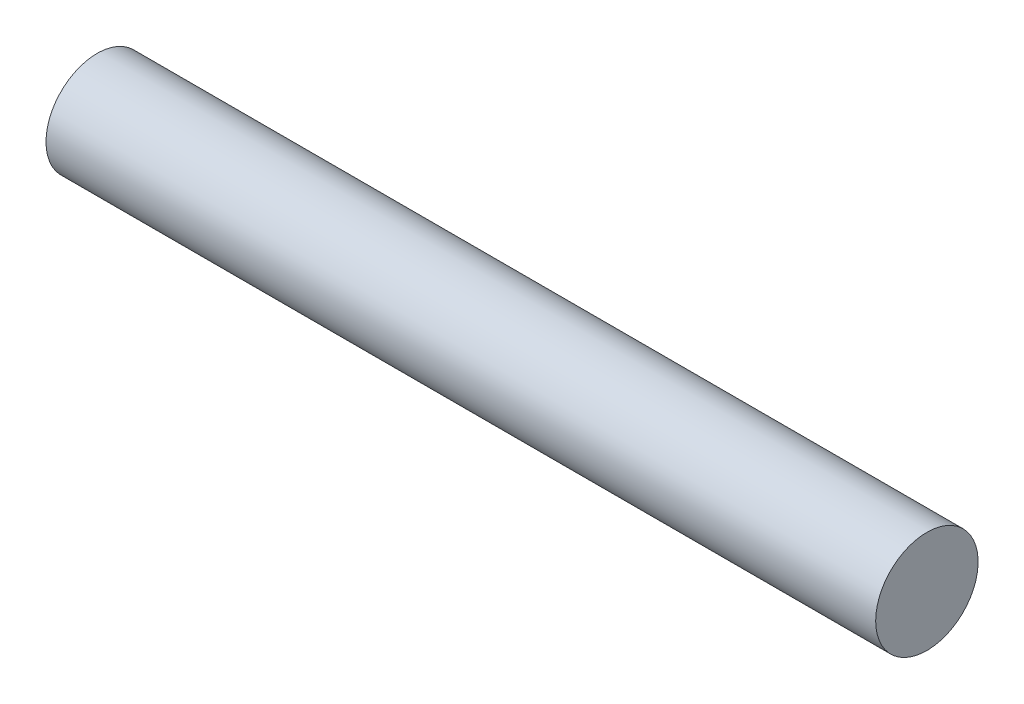
ISO-10303-21;
HEADER;
FILE_DESCRIPTION(('STEP AP214'),'2;1');
FILE_NAME('part.step','',(''),(''),'','','');
FILE_SCHEMA(('AUTOMOTIVE_DESIGN { 1 0 10303 214 1 1 1 1 }'));
ENDSEC;
DATA;
#1=APPLICATION_CONTEXT('core data for automotive mechanical design processes');
#2=APPLICATION_PROTOCOL_DEFINITION('international standard','automotive_design',2000,#1);
#3=PRODUCT_CONTEXT('',#1,'mechanical');
#4=PRODUCT('Part','Part','',(#3));
#5=PRODUCT_RELATED_PRODUCT_CATEGORY('part','',(#4));
#6=PRODUCT_DEFINITION_FORMATION('','',#4);
#7=PRODUCT_DEFINITION_CONTEXT('part definition',#1,'design');
#8=PRODUCT_DEFINITION('design','',#6,#7);
#9=PRODUCT_DEFINITION_SHAPE('','',#8);
#10=(LENGTH_UNIT() NAMED_UNIT(*) SI_UNIT(.MILLI.,.METRE.));
#11=(NAMED_UNIT(*) PLANE_ANGLE_UNIT() SI_UNIT($,.RADIAN.));
#12=(NAMED_UNIT(*) SI_UNIT($,.STERADIAN.) SOLID_ANGLE_UNIT());
#13=UNCERTAINTY_MEASURE_WITH_UNIT(LENGTH_MEASURE(1.E-05),#10,'distance_accuracy_value','');
#14=(GEOMETRIC_REPRESENTATION_CONTEXT(3) GLOBAL_UNCERTAINTY_ASSIGNED_CONTEXT((#13)) GLOBAL_UNIT_ASSIGNED_CONTEXT((#10,
#11,#12)) REPRESENTATION_CONTEXT('',''));
#15=CARTESIAN_POINT('',(0.,0.,0.));
#16=DIRECTION('',(0.,0.,1.));
#17=DIRECTION('',(1.,0.,0.));
#18=AXIS2_PLACEMENT_3D('',#15,#16,#17);
#19=CARTESIAN_POINT('',(0.,0.,0.));
#20=DIRECTION('',(1.,0.,0.));
#21=DIRECTION('',(0.,0.,-1.));
#22=AXIS2_PLACEMENT_3D('',#19,#20,#21);
#23=PLANE('',#22);
#24=CARTESIAN_POINT('',(0.,0.,0.));
#25=DIRECTION('',(-1.,0.,0.));
#26=DIRECTION('',(0.,0.,1.));
#27=AXIS2_PLACEMENT_3D('',#24,#25,#26);
#28=CIRCLE('',#27,1.5);
#29=CARTESIAN_POINT('',(0.,0.,1.5));
#30=VERTEX_POINT('',#29);
#31=EDGE_CURVE('E10',#30,#30,#28,.T.);
#32=ORIENTED_EDGE('',*,*,#31,.T.);
#33=EDGE_LOOP('',(#32));
#34=FACE_BOUND('',#33,.T.);
#35=ADVANCED_FACE('F37',(#34),#23,.F.);
#36=CARTESIAN_POINT('',(0.,0.,0.));
#37=DIRECTION('',(-1.,0.,0.));
#38=DIRECTION('',(0.,0.,1.));
#39=AXIS2_PLACEMENT_3D('',#36,#37,#38);
#40=CYLINDRICAL_SURFACE('',#39,1.5);
#41=ORIENTED_EDGE('',*,*,#31,.F.);
#42=EDGE_LOOP('',(#41));
#43=FACE_BOUND('',#42,.T.);
#44=CARTESIAN_POINT('',(24.3,0.,0.));
#45=DIRECTION('',(-1.,0.,0.));
#46=DIRECTION('',(0.,0.,1.));
#47=AXIS2_PLACEMENT_3D('',#44,#45,#46);
#48=CIRCLE('',#47,1.5);
#49=CARTESIAN_POINT('',(24.3,0.,1.5));
#50=VERTEX_POINT('',#49);
#51=EDGE_CURVE('E43',#50,#50,#48,.T.);
#52=ORIENTED_EDGE('',*,*,#51,.T.);
#53=EDGE_LOOP('',(#52));
#54=FACE_BOUND('',#53,.T.);
#55=ADVANCED_FACE('F49',(#43,#54),#40,.T.);
#56=CARTESIAN_POINT('',(24.3,0.,0.));
#57=DIRECTION('',(-1.,0.,0.));
#58=DIRECTION('',(0.,0.,1.));
#59=AXIS2_PLACEMENT_3D('',#56,#57,#58);
#60=PLANE('',#59);
#61=ORIENTED_EDGE('',*,*,#51,.F.);
#62=EDGE_LOOP('',(#61));
#63=FACE_BOUND('',#62,.T.);
#64=ADVANCED_FACE('F51',(#63),#60,.F.);
#65=CLOSED_SHELL('',(#35,#55,#64));
#66=MANIFOLD_SOLID_BREP('B2',#65);
#67=ADVANCED_BREP_SHAPE_REPRESENTATION('',(#18,#66),#14);
#68=SHAPE_DEFINITION_REPRESENTATION(#9,#67);
ENDSEC;
END-ISO-10303-21;
